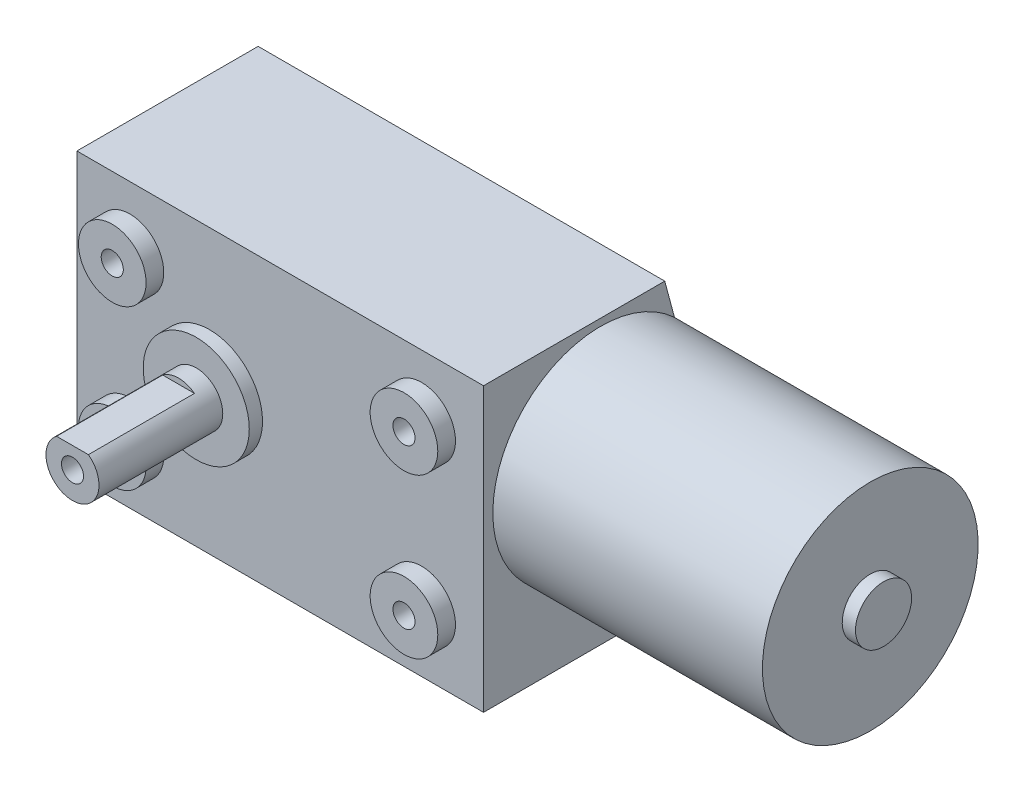
ISO-10303-21;
HEADER;
FILE_DESCRIPTION(('STEP AP214'),'2;1');
FILE_NAME('part.step','',(''),(''),'','','');
FILE_SCHEMA(('AUTOMOTIVE_DESIGN { 1 0 10303 214 1 1 1 1 }'));
ENDSEC;
DATA;
#1=APPLICATION_CONTEXT('core data for automotive mechanical design processes');
#2=APPLICATION_PROTOCOL_DEFINITION('international standard','automotive_design',2000,#1);
#3=PRODUCT_CONTEXT('',#1,'mechanical');
#4=PRODUCT('Part','Part','',(#3));
#5=PRODUCT_RELATED_PRODUCT_CATEGORY('part','',(#4));
#6=PRODUCT_DEFINITION_FORMATION('','',#4);
#7=PRODUCT_DEFINITION_CONTEXT('part definition',#1,'design');
#8=PRODUCT_DEFINITION('design','',#6,#7);
#9=PRODUCT_DEFINITION_SHAPE('','',#8);
#10=(LENGTH_UNIT() NAMED_UNIT(*) SI_UNIT(.MILLI.,.METRE.));
#11=(NAMED_UNIT(*) PLANE_ANGLE_UNIT() SI_UNIT($,.RADIAN.));
#12=(NAMED_UNIT(*) SI_UNIT($,.STERADIAN.) SOLID_ANGLE_UNIT());
#13=UNCERTAINTY_MEASURE_WITH_UNIT(LENGTH_MEASURE(1.E-05),#10,'distance_accuracy_value','');
#14=(GEOMETRIC_REPRESENTATION_CONTEXT(3) GLOBAL_UNCERTAINTY_ASSIGNED_CONTEXT((#13)) GLOBAL_UNIT_ASSIGNED_CONTEXT((#10,
#11,#12)) REPRESENTATION_CONTEXT('',''));
#15=CARTESIAN_POINT('',(0.,0.,0.));
#16=DIRECTION('',(0.,0.,1.));
#17=DIRECTION('',(1.,0.,0.));
#18=AXIS2_PLACEMENT_3D('',#15,#16,#17);
#19=CARTESIAN_POINT('',(61.5,3.00000000000001,-2.));
#20=DIRECTION('',(1.,0.,0.));
#21=DIRECTION('',(0.,1.,0.));
#22=AXIS2_PLACEMENT_3D('',#19,#20,#21);
#23=PLANE('',#22);
#24=CARTESIAN_POINT('',(61.5,3.00000000000001,-2.));
#25=DIRECTION('',(1.,0.,0.));
#26=DIRECTION('',(0.,1.,0.));
#27=AXIS2_PLACEMENT_3D('',#24,#25,#26);
#28=CIRCLE('',#27,12.2);
#29=CARTESIAN_POINT('',(61.5,15.2,-2.));
#30=VERTEX_POINT('',#29);
#31=EDGE_CURVE('E150',#30,#30,#28,.T.);
#32=ORIENTED_EDGE('',*,*,#31,.T.);
#33=EDGE_LOOP('',(#32));
#34=FACE_BOUND('',#33,.T.);
#35=CARTESIAN_POINT('',(61.5,3.00000000000001,-2.));
#36=DIRECTION('',(1.,0.,0.));
#37=DIRECTION('',(0.,1.,0.));
#38=AXIS2_PLACEMENT_3D('',#35,#36,#37);
#39=CIRCLE('',#38,3.175);
#40=CARTESIAN_POINT('',(61.5,6.17500000000001,-2.));
#41=VERTEX_POINT('',#40);
#42=EDGE_CURVE('E156',#41,#41,#39,.T.);
#43=ORIENTED_EDGE('',*,*,#42,.F.);
#44=EDGE_LOOP('',(#43));
#45=FACE_BOUND('',#44,.T.);
#46=ADVANCED_FACE('F41',(#34,#45),#23,.T.);
#47=CARTESIAN_POINT('',(31.,16.,11.25));
#48=DIRECTION('',(-1.,0.,0.));
#49=DIRECTION('',(0.,-1.,0.));
#50=AXIS2_PLACEMENT_3D('',#47,#48,#49);
#51=PLANE('',#50);
#52=CARTESIAN_POINT('',(31.,3.,-2.));
#53=DIRECTION('',(1.,0.,0.));
#54=DIRECTION('',(0.,1.,0.));
#55=AXIS2_PLACEMENT_3D('',#52,#53,#54);
#56=CIRCLE('',#55,12.2);
#57=CARTESIAN_POINT('',(31.,11.894821257883,-10.3499793287357));
#58=VERTEX_POINT('',#57);
#59=CARTESIAN_POINT('',(31.,-4.95471558259627,-11.25));
#60=VERTEX_POINT('',#59);
#61=EDGE_CURVE('E13',#58,#60,#56,.T.);
#62=ORIENTED_EDGE('',*,*,#61,.F.);
#63=DIRECTION('',(0.,-0.965925826289068,-0.258819045102522));
#64=VECTOR('',#63,1.);
#65=CARTESIAN_POINT('',(31.,16.,-9.25));
#66=LINE('',#65,#64);
#67=CARTESIAN_POINT('',(31.,16.,-9.24999999999999));
#68=VERTEX_POINT('',#67);
#69=EDGE_CURVE('E260',#58,#68,#66,.F.);
#70=ORIENTED_EDGE('',*,*,#69,.T.);
#71=DIRECTION('',(0.,0.,-1.));
#72=VECTOR('',#71,1.);
#73=CARTESIAN_POINT('',(31.,16.,11.25));
#74=LINE('',#73,#72);
#75=CARTESIAN_POINT('',(31.,16.,11.25));
#76=VERTEX_POINT('',#75);
#77=EDGE_CURVE('E239',#76,#68,#74,.T.);
#78=ORIENTED_EDGE('',*,*,#77,.F.);
#79=DIRECTION('',(0.,1.,0.));
#80=VECTOR('',#79,1.);
#81=CARTESIAN_POINT('',(31.,16.,11.25));
#82=LINE('',#81,#80);
#83=CARTESIAN_POINT('',(31.,-16.,11.25));
#84=VERTEX_POINT('',#83);
#85=EDGE_CURVE('E230',#84,#76,#82,.T.);
#86=ORIENTED_EDGE('',*,*,#85,.F.);
#87=DIRECTION('',(0.,0.,-1.));
#88=VECTOR('',#87,1.);
#89=CARTESIAN_POINT('',(31.,-16.,11.25));
#90=LINE('',#89,#88);
#91=CARTESIAN_POINT('',(31.,-16.,-9.25));
#92=VERTEX_POINT('',#91);
#93=EDGE_CURVE('E242',#84,#92,#90,.T.);
#94=ORIENTED_EDGE('',*,*,#93,.T.);
#95=DIRECTION('',(0.,-0.965925826289068,0.258819045102522));
#96=VECTOR('',#95,1.);
#97=CARTESIAN_POINT('',(31.,-16.,-9.25));
#98=LINE('',#97,#96);
#99=CARTESIAN_POINT('',(31.,-8.53589838486227,-11.25));
#100=VERTEX_POINT('',#99);
#101=EDGE_CURVE('E130',#92,#100,#98,.F.);
#102=ORIENTED_EDGE('',*,*,#101,.T.);
#103=DIRECTION('',(0.,1.,0.));
#104=VECTOR('',#103,1.);
#105=CARTESIAN_POINT('',(31.,16.,-11.25));
#106=LINE('',#105,#104);
#107=EDGE_CURVE('E126',#100,#60,#106,.T.);
#108=ORIENTED_EDGE('',*,*,#107,.T.);
#109=EDGE_LOOP('',(#62,#70,#78,#86,#94,#102,#108));
#110=FACE_BOUND('',#109,.T.);
#111=ADVANCED_FACE('F128',(#110),#51,.F.);
#112=CARTESIAN_POINT('',(0.,0.,12.75));
#113=DIRECTION('',(0.,0.,1.));
#114=DIRECTION('',(1.,0.,0.));
#115=AXIS2_PLACEMENT_3D('',#112,#113,#114);
#116=PLANE('',#115);
#117=CARTESIAN_POINT('',(0.,0.,12.75));
#118=DIRECTION('',(0.,0.,1.));
#119=DIRECTION('',(1.,0.,0.));
#120=AXIS2_PLACEMENT_3D('',#117,#118,#119);
#121=CIRCLE('',#120,6.);
#122=CARTESIAN_POINT('',(6.,0.,12.75));
#123=VERTEX_POINT('',#122);
#124=EDGE_CURVE('E220',#123,#123,#121,.T.);
#125=ORIENTED_EDGE('',*,*,#124,.T.);
#126=EDGE_LOOP('',(#125));
#127=FACE_BOUND('',#126,.T.);
#128=CARTESIAN_POINT('',(0.,0.,12.75));
#129=DIRECTION('',(0.,0.,1.));
#130=DIRECTION('',(1.,0.,0.));
#131=AXIS2_PLACEMENT_3D('',#128,#129,#130);
#132=CIRCLE('',#131,3.);
#133=CARTESIAN_POINT('',(3.,0.,12.75));
#134=VERTEX_POINT('',#133);
#135=EDGE_CURVE('E197',#134,#134,#132,.T.);
#136=ORIENTED_EDGE('',*,*,#135,.F.);
#137=EDGE_LOOP('',(#136));
#138=FACE_BOUND('',#137,.T.);
#139=ADVANCED_FACE('F297',(#127,#138),#116,.T.);
#140=CARTESIAN_POINT('',(0.,0.,11.25));
#141=DIRECTION('',(0.,0.,1.));
#142=DIRECTION('',(1.,0.,0.));
#143=AXIS2_PLACEMENT_3D('',#140,#141,#142);
#144=PLANE('',#143);
#145=CARTESIAN_POINT('',(24.,9.,11.25));
#146=DIRECTION('',(0.,0.,1.));
#147=DIRECTION('',(1.,0.,0.));
#148=AXIS2_PLACEMENT_3D('',#145,#146,#147);
#149=CIRCLE('',#148,3.825);
#150=CARTESIAN_POINT('',(27.825,9.,11.25));
#151=VERTEX_POINT('',#150);
#152=EDGE_CURVE('E208',#151,#151,#149,.T.);
#153=ORIENTED_EDGE('',*,*,#152,.F.);
#154=EDGE_LOOP('',(#153));
#155=FACE_BOUND('',#154,.T.);
#156=CARTESIAN_POINT('',(-9.,9.,11.25));
#157=DIRECTION('',(0.,0.,1.));
#158=DIRECTION('',(1.,0.,0.));
#159=AXIS2_PLACEMENT_3D('',#156,#157,#158);
#160=CIRCLE('',#159,3.825);
#161=CARTESIAN_POINT('',(-5.175,9.,11.25));
#162=VERTEX_POINT('',#161);
#163=EDGE_CURVE('E216',#162,#162,#160,.T.);
#164=ORIENTED_EDGE('',*,*,#163,.F.);
#165=EDGE_LOOP('',(#164));
#166=FACE_BOUND('',#165,.T.);
#167=DIRECTION('',(0.,-1.,0.));
#168=VECTOR('',#167,1.);
#169=CARTESIAN_POINT('',(-15.,16.,11.25));
#170=LINE('',#169,#168);
#171=CARTESIAN_POINT('',(-15.,16.,11.25));
#172=VERTEX_POINT('',#171);
#173=CARTESIAN_POINT('',(-15.,-16.,11.25));
#174=VERTEX_POINT('',#173);
#175=EDGE_CURVE('E133',#172,#174,#170,.T.);
#176=ORIENTED_EDGE('',*,*,#175,.T.);
#177=DIRECTION('',(1.,0.,0.));
#178=VECTOR('',#177,1.);
#179=CARTESIAN_POINT('',(-15.,-16.,11.25));
#180=LINE('',#179,#178);
#181=EDGE_CURVE('E228',#174,#84,#180,.T.);
#182=ORIENTED_EDGE('',*,*,#181,.T.);
#183=ORIENTED_EDGE('',*,*,#85,.T.);
#184=DIRECTION('',(-1.,0.,0.));
#185=VECTOR('',#184,1.);
#186=CARTESIAN_POINT('',(-15.,16.,11.25));
#187=LINE('',#186,#185);
#188=EDGE_CURVE('E232',#76,#172,#187,.T.);
#189=ORIENTED_EDGE('',*,*,#188,.T.);
#190=EDGE_LOOP('',(#176,#182,#183,#189));
#191=FACE_BOUND('',#190,.T.);
#192=CARTESIAN_POINT('',(0.,0.,11.25));
#193=DIRECTION('',(0.,0.,1.));
#194=DIRECTION('',(1.,0.,0.));
#195=AXIS2_PLACEMENT_3D('',#192,#193,#194);
#196=CIRCLE('',#195,6.);
#197=CARTESIAN_POINT('',(6.,0.,11.25));
#198=VERTEX_POINT('',#197);
#199=EDGE_CURVE('E223',#198,#198,#196,.T.);
#200=ORIENTED_EDGE('',*,*,#199,.F.);
#201=EDGE_LOOP('',(#200));
#202=FACE_BOUND('',#201,.T.);
#203=CARTESIAN_POINT('',(-9.,-9.,11.25));
#204=DIRECTION('',(0.,0.,1.));
#205=DIRECTION('',(1.,0.,0.));
#206=AXIS2_PLACEMENT_3D('',#203,#204,#205);
#207=CIRCLE('',#206,3.825);
#208=CARTESIAN_POINT('',(-5.175,-9.,11.25));
#209=VERTEX_POINT('',#208);
#210=EDGE_CURVE('E212',#209,#209,#207,.T.);
#211=ORIENTED_EDGE('',*,*,#210,.F.);
#212=EDGE_LOOP('',(#211));
#213=FACE_BOUND('',#212,.T.);
#214=CARTESIAN_POINT('',(24.,-9.,11.25));
#215=DIRECTION('',(0.,0.,1.));
#216=DIRECTION('',(1.,0.,0.));
#217=AXIS2_PLACEMENT_3D('',#214,#215,#216);
#218=CIRCLE('',#217,3.825);
#219=CARTESIAN_POINT('',(27.825,-9.,11.25));
#220=VERTEX_POINT('',#219);
#221=EDGE_CURVE('E202',#220,#220,#218,.T.);
#222=ORIENTED_EDGE('',*,*,#221,.F.);
#223=EDGE_LOOP('',(#222));
#224=FACE_BOUND('',#223,.T.);
#225=ADVANCED_FACE('F278',(#155,#166,#191,#202,#213,#224),#144,.T.);
#226=CARTESIAN_POINT('',(-15.,16.,11.25));
#227=DIRECTION('',(1.,0.,0.));
#228=DIRECTION('',(0.,1.,0.));
#229=AXIS2_PLACEMENT_3D('',#226,#227,#228);
#230=PLANE('',#229);
#231=DIRECTION('',(0.,-1.,0.));
#232=VECTOR('',#231,1.);
#233=CARTESIAN_POINT('',(-15.,16.,-11.25));
#234=LINE('',#233,#232);
#235=CARTESIAN_POINT('',(-15.,8.53589838486227,-11.25));
#236=VERTEX_POINT('',#235);
#237=CARTESIAN_POINT('',(-15.,-8.53589838486205,-11.25));
#238=VERTEX_POINT('',#237);
#239=EDGE_CURVE('E144',#236,#238,#234,.T.);
#240=ORIENTED_EDGE('',*,*,#239,.T.);
#241=DIRECTION('',(0.,0.965925826289068,-0.258819045102522));
#242=VECTOR('',#241,1.);
#243=CARTESIAN_POINT('',(-15.,-16.,-9.25));
#244=LINE('',#243,#242);
#245=CARTESIAN_POINT('',(-15.,-16.,-9.25));
#246=VERTEX_POINT('',#245);
#247=EDGE_CURVE('E266',#238,#246,#244,.F.);
#248=ORIENTED_EDGE('',*,*,#247,.T.);
#249=DIRECTION('',(0.,0.,-1.));
#250=VECTOR('',#249,1.);
#251=CARTESIAN_POINT('',(-15.,-16.,11.25));
#252=LINE('',#251,#250);
#253=EDGE_CURVE('E244',#174,#246,#252,.T.);
#254=ORIENTED_EDGE('',*,*,#253,.F.);
#255=ORIENTED_EDGE('',*,*,#175,.F.);
#256=DIRECTION('',(0.,0.,-1.));
#257=VECTOR('',#256,1.);
#258=CARTESIAN_POINT('',(-15.,16.,11.25));
#259=LINE('',#258,#257);
#260=CARTESIAN_POINT('',(-15.,16.,-9.24999999999999));
#261=VERTEX_POINT('',#260);
#262=EDGE_CURVE('E234',#172,#261,#259,.T.);
#263=ORIENTED_EDGE('',*,*,#262,.T.);
#264=DIRECTION('',(0.,0.965925826289068,0.258819045102522));
#265=VECTOR('',#264,1.);
#266=CARTESIAN_POINT('',(-15.,16.,-9.25));
#267=LINE('',#266,#265);
#268=EDGE_CURVE('E64',#261,#236,#267,.F.);
#269=ORIENTED_EDGE('',*,*,#268,.T.);
#270=EDGE_LOOP('',(#240,#248,#254,#255,#263,#269));
#271=FACE_BOUND('',#270,.T.);
#272=ADVANCED_FACE('F276',(#271),#230,.F.);
#273=CARTESIAN_POINT('',(-15.,-16.,11.25));
#274=DIRECTION('',(0.,1.,0.));
#275=DIRECTION('',(-1.,0.,0.));
#276=AXIS2_PLACEMENT_3D('',#273,#274,#275);
#277=PLANE('',#276);
#278=ORIENTED_EDGE('',*,*,#253,.T.);
#279=DIRECTION('',(1.,0.,0.));
#280=VECTOR('',#279,1.);
#281=CARTESIAN_POINT('',(-15.,-16.,-9.25));
#282=LINE('',#281,#280);
#283=EDGE_CURVE('E257',#246,#92,#282,.T.);
#284=ORIENTED_EDGE('',*,*,#283,.T.);
#285=ORIENTED_EDGE('',*,*,#93,.F.);
#286=ORIENTED_EDGE('',*,*,#181,.F.);
#287=EDGE_LOOP('',(#278,#284,#285,#286));
#288=FACE_BOUND('',#287,.T.);
#289=ADVANCED_FACE('F396',(#288),#277,.F.);
#290=CARTESIAN_POINT('',(-15.,16.,11.25));
#291=DIRECTION('',(0.,-1.,0.));
#292=DIRECTION('',(0.,0.,-1.));
#293=AXIS2_PLACEMENT_3D('',#290,#291,#292);
#294=PLANE('',#293);
#295=ORIENTED_EDGE('',*,*,#77,.T.);
#296=DIRECTION('',(-1.,0.,0.));
#297=VECTOR('',#296,1.);
#298=CARTESIAN_POINT('',(-15.,16.,-9.25));
#299=LINE('',#298,#297);
#300=EDGE_CURVE('E45',#68,#261,#299,.T.);
#301=ORIENTED_EDGE('',*,*,#300,.T.);
#302=ORIENTED_EDGE('',*,*,#262,.F.);
#303=ORIENTED_EDGE('',*,*,#188,.F.);
#304=EDGE_LOOP('',(#295,#301,#302,#303));
#305=FACE_BOUND('',#304,.T.);
#306=ADVANCED_FACE('F272',(#305),#294,.F.);
#307=CARTESIAN_POINT('',(0.,0.,-11.25));
#308=DIRECTION('',(0.,0.,1.));
#309=DIRECTION('',(1.,0.,0.));
#310=AXIS2_PLACEMENT_3D('',#307,#308,#309);
#311=PLANE('',#310);
#312=ORIENTED_EDGE('',*,*,#107,.F.);
#313=DIRECTION('',(-1.,0.,0.));
#314=VECTOR('',#313,1.);
#315=CARTESIAN_POINT('',(0.,-8.53589838486228,-11.25));
#316=LINE('',#315,#314);
#317=EDGE_CURVE('E264',#100,#238,#316,.T.);
#318=ORIENTED_EDGE('',*,*,#317,.T.);
#319=ORIENTED_EDGE('',*,*,#239,.F.);
#320=DIRECTION('',(1.,0.,0.));
#321=VECTOR('',#320,1.);
#322=CARTESIAN_POINT('',(0.,8.53589838486227,-11.25));
#323=LINE('',#322,#321);
#324=CARTESIAN_POINT('',(31.,8.53589838486226,-11.25));
#325=VERTEX_POINT('',#324);
#326=EDGE_CURVE('E139',#236,#325,#323,.T.);
#327=ORIENTED_EDGE('',*,*,#326,.T.);
#328=EDGE_CURVE('E134',#60,#325,#106,.T.);
#329=ORIENTED_EDGE('',*,*,#328,.F.);
#330=EDGE_LOOP('',(#312,#318,#319,#327,#329));
#331=FACE_BOUND('',#330,.T.);
#332=ADVANCED_FACE('F137',(#331),#311,.F.);
#333=CARTESIAN_POINT('',(0.,0.,12.75));
#334=DIRECTION('',(0.,0.,-1.));
#335=DIRECTION('',(-1.,0.,0.));
#336=AXIS2_PLACEMENT_3D('',#333,#334,#335);
#337=CYLINDRICAL_SURFACE('',#336,6.);
#338=ORIENTED_EDGE('',*,*,#124,.F.);
#339=EDGE_LOOP('',(#338));
#340=FACE_BOUND('',#339,.T.);
#341=ORIENTED_EDGE('',*,*,#199,.T.);
#342=EDGE_LOOP('',(#341));
#343=FACE_BOUND('',#342,.T.);
#344=ADVANCED_FACE('F382',(#340,#343),#337,.T.);
#345=CARTESIAN_POINT('',(-9.,9.,12.75));
#346=DIRECTION('',(0.,0.,-1.));
#347=DIRECTION('',(-1.,0.,0.));
#348=AXIS2_PLACEMENT_3D('',#345,#346,#347);
#349=CYLINDRICAL_SURFACE('',#348,3.825);
#350=CARTESIAN_POINT('',(-9.,9.,13.25));
#351=DIRECTION('',(0.,0.,1.));
#352=DIRECTION('',(1.,0.,0.));
#353=AXIS2_PLACEMENT_3D('',#350,#351,#352);
#354=CIRCLE('',#353,3.825);
#355=CARTESIAN_POINT('',(-5.175,9.,13.25));
#356=VERTEX_POINT('',#355);
#357=EDGE_CURVE('E219',#356,#356,#354,.T.);
#358=ORIENTED_EDGE('',*,*,#357,.F.);
#359=EDGE_LOOP('',(#358));
#360=FACE_BOUND('',#359,.T.);
#361=ORIENTED_EDGE('',*,*,#163,.T.);
#362=EDGE_LOOP('',(#361));
#363=FACE_BOUND('',#362,.T.);
#364=ADVANCED_FACE('F379',(#360,#363),#349,.T.);
#365=CARTESIAN_POINT('',(-9.,9.,13.25));
#366=DIRECTION('',(0.,0.,1.));
#367=DIRECTION('',(1.,0.,0.));
#368=AXIS2_PLACEMENT_3D('',#365,#366,#367);
#369=PLANE('',#368);
#370=CARTESIAN_POINT('',(-9.,9.,13.25));
#371=DIRECTION('',(0.,0.,1.));
#372=DIRECTION('',(1.,0.,0.));
#373=AXIS2_PLACEMENT_3D('',#370,#371,#372);
#374=CIRCLE('',#373,1.24999999999999);
#375=CARTESIAN_POINT('',(-7.75000000000001,9.,13.25));
#376=VERTEX_POINT('',#375);
#377=EDGE_CURVE('E164',#376,#376,#374,.T.);
#378=ORIENTED_EDGE('',*,*,#377,.F.);
#379=EDGE_LOOP('',(#378));
#380=FACE_BOUND('',#379,.T.);
#381=ORIENTED_EDGE('',*,*,#357,.T.);
#382=EDGE_LOOP('',(#381));
#383=FACE_BOUND('',#382,.T.);
#384=ADVANCED_FACE('F377',(#380,#383),#369,.T.);
#385=CARTESIAN_POINT('',(-9.,-9.,12.75));
#386=DIRECTION('',(0.,0.,-1.));
#387=DIRECTION('',(-1.,0.,0.));
#388=AXIS2_PLACEMENT_3D('',#385,#386,#387);
#389=CYLINDRICAL_SURFACE('',#388,3.825);
#390=CARTESIAN_POINT('',(-9.,-9.,13.25));
#391=DIRECTION('',(0.,0.,1.));
#392=DIRECTION('',(1.,0.,0.));
#393=AXIS2_PLACEMENT_3D('',#390,#391,#392);
#394=CIRCLE('',#393,3.825);
#395=CARTESIAN_POINT('',(-5.175,-9.,13.25));
#396=VERTEX_POINT('',#395);
#397=EDGE_CURVE('E215',#396,#396,#394,.T.);
#398=ORIENTED_EDGE('',*,*,#397,.F.);
#399=EDGE_LOOP('',(#398));
#400=FACE_BOUND('',#399,.T.);
#401=ORIENTED_EDGE('',*,*,#210,.T.);
#402=EDGE_LOOP('',(#401));
#403=FACE_BOUND('',#402,.T.);
#404=ADVANCED_FACE('F374',(#400,#403),#389,.T.);
#405=CARTESIAN_POINT('',(-9.,-9.,13.25));
#406=DIRECTION('',(0.,0.,1.));
#407=DIRECTION('',(1.,0.,0.));
#408=AXIS2_PLACEMENT_3D('',#405,#406,#407);
#409=PLANE('',#408);
#410=CARTESIAN_POINT('',(-9.,-9.,13.25));
#411=DIRECTION('',(0.,0.,1.));
#412=DIRECTION('',(1.,0.,0.));
#413=AXIS2_PLACEMENT_3D('',#410,#411,#412);
#414=CIRCLE('',#413,1.24999999999999);
#415=CARTESIAN_POINT('',(-7.75000000000001,-9.,13.25));
#416=VERTEX_POINT('',#415);
#417=EDGE_CURVE('E170',#416,#416,#414,.T.);
#418=ORIENTED_EDGE('',*,*,#417,.F.);
#419=EDGE_LOOP('',(#418));
#420=FACE_BOUND('',#419,.T.);
#421=ORIENTED_EDGE('',*,*,#397,.T.);
#422=EDGE_LOOP('',(#421));
#423=FACE_BOUND('',#422,.T.);
#424=ADVANCED_FACE('F372',(#420,#423),#409,.T.);
#425=CARTESIAN_POINT('',(24.,9.,12.75));
#426=DIRECTION('',(0.,0.,-1.));
#427=DIRECTION('',(-1.,0.,0.));
#428=AXIS2_PLACEMENT_3D('',#425,#426,#427);
#429=CYLINDRICAL_SURFACE('',#428,3.825);
#430=CARTESIAN_POINT('',(24.,9.,13.25));
#431=DIRECTION('',(0.,0.,1.));
#432=DIRECTION('',(1.,0.,0.));
#433=AXIS2_PLACEMENT_3D('',#430,#431,#432);
#434=CIRCLE('',#433,3.825);
#435=CARTESIAN_POINT('',(27.825,9.,13.25));
#436=VERTEX_POINT('',#435);
#437=EDGE_CURVE('E211',#436,#436,#434,.T.);
#438=ORIENTED_EDGE('',*,*,#437,.F.);
#439=EDGE_LOOP('',(#438));
#440=FACE_BOUND('',#439,.T.);
#441=ORIENTED_EDGE('',*,*,#152,.T.);
#442=EDGE_LOOP('',(#441));
#443=FACE_BOUND('',#442,.T.);
#444=ADVANCED_FACE('F369',(#440,#443),#429,.T.);
#445=CARTESIAN_POINT('',(24.,9.,13.25));
#446=DIRECTION('',(0.,0.,1.));
#447=DIRECTION('',(1.,0.,0.));
#448=AXIS2_PLACEMENT_3D('',#445,#446,#447);
#449=PLANE('',#448);
#450=CARTESIAN_POINT('',(24.,9.,13.25));
#451=DIRECTION('',(0.,0.,1.));
#452=DIRECTION('',(1.,0.,0.));
#453=AXIS2_PLACEMENT_3D('',#450,#451,#452);
#454=CIRCLE('',#453,1.24999999999999);
#455=CARTESIAN_POINT('',(25.25,9.,13.25));
#456=VERTEX_POINT('',#455);
#457=EDGE_CURVE('E176',#456,#456,#454,.T.);
#458=ORIENTED_EDGE('',*,*,#457,.F.);
#459=EDGE_LOOP('',(#458));
#460=FACE_BOUND('',#459,.T.);
#461=ORIENTED_EDGE('',*,*,#437,.T.);
#462=EDGE_LOOP('',(#461));
#463=FACE_BOUND('',#462,.T.);
#464=ADVANCED_FACE('F367',(#460,#463),#449,.T.);
#465=CARTESIAN_POINT('',(24.,-9.,12.75));
#466=DIRECTION('',(0.,0.,-1.));
#467=DIRECTION('',(-1.,0.,0.));
#468=AXIS2_PLACEMENT_3D('',#465,#466,#467);
#469=CYLINDRICAL_SURFACE('',#468,3.825);
#470=CARTESIAN_POINT('',(24.,-9.,13.25));
#471=DIRECTION('',(0.,0.,1.));
#472=DIRECTION('',(1.,0.,0.));
#473=AXIS2_PLACEMENT_3D('',#470,#471,#472);
#474=CIRCLE('',#473,3.825);
#475=CARTESIAN_POINT('',(27.825,-9.,13.25));
#476=VERTEX_POINT('',#475);
#477=EDGE_CURVE('E207',#476,#476,#474,.T.);
#478=ORIENTED_EDGE('',*,*,#477,.F.);
#479=EDGE_LOOP('',(#478));
#480=FACE_BOUND('',#479,.T.);
#481=ORIENTED_EDGE('',*,*,#221,.T.);
#482=EDGE_LOOP('',(#481));
#483=FACE_BOUND('',#482,.T.);
#484=ADVANCED_FACE('F364',(#480,#483),#469,.T.);
#485=CARTESIAN_POINT('',(24.,-9.,13.25));
#486=DIRECTION('',(0.,0.,1.));
#487=DIRECTION('',(1.,0.,0.));
#488=AXIS2_PLACEMENT_3D('',#485,#486,#487);
#489=PLANE('',#488);
#490=CARTESIAN_POINT('',(24.,-9.,13.25));
#491=DIRECTION('',(0.,0.,1.));
#492=DIRECTION('',(1.,0.,0.));
#493=AXIS2_PLACEMENT_3D('',#490,#491,#492);
#494=CIRCLE('',#493,1.24999999999999);
#495=CARTESIAN_POINT('',(25.25,-9.,13.25));
#496=VERTEX_POINT('',#495);
#497=EDGE_CURVE('E182',#496,#496,#494,.T.);
#498=ORIENTED_EDGE('',*,*,#497,.F.);
#499=EDGE_LOOP('',(#498));
#500=FACE_BOUND('',#499,.T.);
#501=ORIENTED_EDGE('',*,*,#477,.T.);
#502=EDGE_LOOP('',(#501));
#503=FACE_BOUND('',#502,.T.);
#504=ADVANCED_FACE('F362',(#500,#503),#489,.T.);
#505=CARTESIAN_POINT('',(0.,0.,26.75));
#506=DIRECTION('',(0.,0.,-1.));
#507=DIRECTION('',(-1.,0.,0.));
#508=AXIS2_PLACEMENT_3D('',#505,#506,#507);
#509=CYLINDRICAL_SURFACE('',#508,3.);
#510=CARTESIAN_POINT('',(0.,0.,26.75));
#511=DIRECTION('',(0.,0.,1.));
#512=DIRECTION('',(1.,0.,0.));
#513=AXIS2_PLACEMENT_3D('',#510,#511,#512);
#514=CIRCLE('',#513,3.);
#515=CARTESIAN_POINT('',(-1.8,2.4,26.75));
#516=VERTEX_POINT('',#515);
#517=CARTESIAN_POINT('',(1.8,2.4,26.75));
#518=VERTEX_POINT('',#517);
#519=EDGE_CURVE('E199',#516,#518,#514,.T.);
#520=ORIENTED_EDGE('',*,*,#519,.F.);
#521=DIRECTION('',(0.,0.,1.));
#522=VECTOR('',#521,1.);
#523=CARTESIAN_POINT('',(-1.8,2.4,14.75));
#524=LINE('',#523,#522);
#525=CARTESIAN_POINT('',(-1.8,2.4,14.75));
#526=VERTEX_POINT('',#525);
#527=EDGE_CURVE('E192',#526,#516,#524,.T.);
#528=ORIENTED_EDGE('',*,*,#527,.F.);
#529=CARTESIAN_POINT('',(0.,0.,14.75));
#530=DIRECTION('',(0.,0.,1.));
#531=DIRECTION('',(1.,0.,0.));
#532=AXIS2_PLACEMENT_3D('',#529,#530,#531);
#533=CIRCLE('',#532,3.);
#534=CARTESIAN_POINT('',(1.8,2.4,14.75));
#535=VERTEX_POINT('',#534);
#536=EDGE_CURVE('E247',#535,#526,#533,.T.);
#537=ORIENTED_EDGE('',*,*,#536,.F.);
#538=DIRECTION('',(0.,0.,1.));
#539=VECTOR('',#538,1.);
#540=CARTESIAN_POINT('',(1.8,2.4,14.75));
#541=LINE('',#540,#539);
#542=EDGE_CURVE('E194',#535,#518,#541,.T.);
#543=ORIENTED_EDGE('',*,*,#542,.T.);
#544=EDGE_LOOP('',(#520,#528,#537,#543));
#545=FACE_BOUND('',#544,.T.);
#546=ORIENTED_EDGE('',*,*,#135,.T.);
#547=EDGE_LOOP('',(#546));
#548=FACE_BOUND('',#547,.T.);
#549=ADVANCED_FACE('F358',(#545,#548),#509,.T.);
#550=CARTESIAN_POINT('',(0.,0.,26.75));
#551=DIRECTION('',(0.,0.,1.));
#552=DIRECTION('',(1.,0.,0.));
#553=AXIS2_PLACEMENT_3D('',#550,#551,#552);
#554=PLANE('',#553);
#555=CARTESIAN_POINT('',(0.,0.,26.75));
#556=DIRECTION('',(0.,0.,1.));
#557=DIRECTION('',(1.,0.,0.));
#558=AXIS2_PLACEMENT_3D('',#555,#556,#557);
#559=CIRCLE('',#558,1.24999999999999);
#560=CARTESIAN_POINT('',(1.24999999999999,0.,26.75));
#561=VERTEX_POINT('',#560);
#562=EDGE_CURVE('E153',#561,#561,#559,.T.);
#563=ORIENTED_EDGE('',*,*,#562,.F.);
#564=EDGE_LOOP('',(#563));
#565=FACE_BOUND('',#564,.T.);
#566=DIRECTION('',(1.,0.,0.));
#567=VECTOR('',#566,1.);
#568=CARTESIAN_POINT('',(-1.8,2.4,26.75));
#569=LINE('',#568,#567);
#570=EDGE_CURVE('E188',#516,#518,#569,.T.);
#571=ORIENTED_EDGE('',*,*,#570,.F.);
#572=ORIENTED_EDGE('',*,*,#519,.T.);
#573=EDGE_LOOP('',(#571,#572));
#574=FACE_BOUND('',#573,.T.);
#575=ADVANCED_FACE('F351',(#565,#574),#554,.T.);
#576=CARTESIAN_POINT('',(0.,0.,14.75));
#577=DIRECTION('',(0.,0.,1.));
#578=DIRECTION('',(1.,0.,0.));
#579=AXIS2_PLACEMENT_3D('',#576,#577,#578);
#580=PLANE('',#579);
#581=DIRECTION('',(1.,0.,0.));
#582=VECTOR('',#581,1.);
#583=CARTESIAN_POINT('',(-1.8,2.4,14.75));
#584=LINE('',#583,#582);
#585=EDGE_CURVE('E189',#526,#535,#584,.T.);
#586=ORIENTED_EDGE('',*,*,#585,.T.);
#587=ORIENTED_EDGE('',*,*,#536,.T.);
#588=EDGE_LOOP('',(#586,#587));
#589=FACE_BOUND('',#588,.T.);
#590=ADVANCED_FACE('F348',(#589),#580,.T.);
#591=CARTESIAN_POINT('',(-1.8,2.4,14.75));
#592=DIRECTION('',(0.,-1.,0.));
#593=DIRECTION('',(0.,0.,-1.));
#594=AXIS2_PLACEMENT_3D('',#591,#592,#593);
#595=PLANE('',#594);
#596=ORIENTED_EDGE('',*,*,#570,.T.);
#597=ORIENTED_EDGE('',*,*,#542,.F.);
#598=ORIENTED_EDGE('',*,*,#585,.F.);
#599=ORIENTED_EDGE('',*,*,#527,.T.);
#600=EDGE_LOOP('',(#596,#597,#598,#599));
#601=FACE_BOUND('',#600,.T.);
#602=ADVANCED_FACE('F346',(#601),#595,.F.);
#603=CARTESIAN_POINT('',(24.,-9.,4.75));
#604=DIRECTION('',(0.,0.,1.));
#605=DIRECTION('',(1.,0.,0.));
#606=AXIS2_PLACEMENT_3D('',#603,#604,#605);
#607=CONICAL_SURFACE('',#606,1.25,1.02974425867665);
#608=CARTESIAN_POINT('',(24.,-9.,3.99892422621555));
#609=VERTEX_POINT('',#608);
#610=VERTEX_LOOP('',#609);
#611=FACE_BOUND('',#610,.T.);
#612=CARTESIAN_POINT('',(24.,-9.,4.75));
#613=DIRECTION('',(0.,0.,1.));
#614=DIRECTION('',(1.,0.,0.));
#615=AXIS2_PLACEMENT_3D('',#612,#613,#614);
#616=CIRCLE('',#615,1.25);
#617=CARTESIAN_POINT('',(25.25,-9.,4.75));
#618=VERTEX_POINT('',#617);
#619=EDGE_CURVE('E185',#618,#618,#616,.T.);
#620=ORIENTED_EDGE('',*,*,#619,.T.);
#621=EDGE_LOOP('',(#620));
#622=FACE_BOUND('',#621,.T.);
#623=ADVANCED_FACE('F342',(#611,#622),#607,.F.);
#624=CARTESIAN_POINT('',(24.,-9.,13.25));
#625=DIRECTION('',(0.,0.,1.));
#626=DIRECTION('',(1.,0.,0.));
#627=AXIS2_PLACEMENT_3D('',#624,#625,#626);
#628=CYLINDRICAL_SURFACE('',#627,1.24999999999999);
#629=ORIENTED_EDGE('',*,*,#619,.F.);
#630=EDGE_LOOP('',(#629));
#631=FACE_BOUND('',#630,.T.);
#632=ORIENTED_EDGE('',*,*,#497,.T.);
#633=EDGE_LOOP('',(#632));
#634=FACE_BOUND('',#633,.T.);
#635=ADVANCED_FACE('F338',(#631,#634),#628,.F.);
#636=CARTESIAN_POINT('',(24.,9.,4.75));
#637=DIRECTION('',(0.,0.,1.));
#638=DIRECTION('',(1.,0.,0.));
#639=AXIS2_PLACEMENT_3D('',#636,#637,#638);
#640=CONICAL_SURFACE('',#639,1.25,1.02974425867665);
#641=CARTESIAN_POINT('',(24.,9.,3.99892422621555));
#642=VERTEX_POINT('',#641);
#643=VERTEX_LOOP('',#642);
#644=FACE_BOUND('',#643,.T.);
#645=CARTESIAN_POINT('',(24.,9.,4.75));
#646=DIRECTION('',(0.,0.,1.));
#647=DIRECTION('',(1.,0.,0.));
#648=AXIS2_PLACEMENT_3D('',#645,#646,#647);
#649=CIRCLE('',#648,1.25);
#650=CARTESIAN_POINT('',(25.25,9.,4.75));
#651=VERTEX_POINT('',#650);
#652=EDGE_CURVE('E179',#651,#651,#649,.T.);
#653=ORIENTED_EDGE('',*,*,#652,.T.);
#654=EDGE_LOOP('',(#653));
#655=FACE_BOUND('',#654,.T.);
#656=ADVANCED_FACE('F334',(#644,#655),#640,.F.);
#657=CARTESIAN_POINT('',(24.,9.,13.25));
#658=DIRECTION('',(0.,0.,1.));
#659=DIRECTION('',(1.,0.,0.));
#660=AXIS2_PLACEMENT_3D('',#657,#658,#659);
#661=CYLINDRICAL_SURFACE('',#660,1.24999999999999);
#662=ORIENTED_EDGE('',*,*,#652,.F.);
#663=EDGE_LOOP('',(#662));
#664=FACE_BOUND('',#663,.T.);
#665=ORIENTED_EDGE('',*,*,#457,.T.);
#666=EDGE_LOOP('',(#665));
#667=FACE_BOUND('',#666,.T.);
#668=ADVANCED_FACE('F330',(#664,#667),#661,.F.);
#669=CARTESIAN_POINT('',(-9.,-9.,4.75));
#670=DIRECTION('',(0.,0.,1.));
#671=DIRECTION('',(1.,0.,0.));
#672=AXIS2_PLACEMENT_3D('',#669,#670,#671);
#673=CONICAL_SURFACE('',#672,1.25,1.02974425867665);
#674=CARTESIAN_POINT('',(-9.,-9.,3.99892422621555));
#675=VERTEX_POINT('',#674);
#676=VERTEX_LOOP('',#675);
#677=FACE_BOUND('',#676,.T.);
#678=CARTESIAN_POINT('',(-9.,-9.,4.75));
#679=DIRECTION('',(0.,0.,1.));
#680=DIRECTION('',(1.,0.,0.));
#681=AXIS2_PLACEMENT_3D('',#678,#679,#680);
#682=CIRCLE('',#681,1.25);
#683=CARTESIAN_POINT('',(-7.75,-9.,4.75));
#684=VERTEX_POINT('',#683);
#685=EDGE_CURVE('E173',#684,#684,#682,.T.);
#686=ORIENTED_EDGE('',*,*,#685,.T.);
#687=EDGE_LOOP('',(#686));
#688=FACE_BOUND('',#687,.T.);
#689=ADVANCED_FACE('F326',(#677,#688),#673,.F.);
#690=CARTESIAN_POINT('',(-9.,-9.,13.25));
#691=DIRECTION('',(0.,0.,1.));
#692=DIRECTION('',(1.,0.,0.));
#693=AXIS2_PLACEMENT_3D('',#690,#691,#692);
#694=CYLINDRICAL_SURFACE('',#693,1.24999999999999);
#695=ORIENTED_EDGE('',*,*,#685,.F.);
#696=EDGE_LOOP('',(#695));
#697=FACE_BOUND('',#696,.T.);
#698=ORIENTED_EDGE('',*,*,#417,.T.);
#699=EDGE_LOOP('',(#698));
#700=FACE_BOUND('',#699,.T.);
#701=ADVANCED_FACE('F322',(#697,#700),#694,.F.);
#702=CARTESIAN_POINT('',(-9.,9.,4.75));
#703=DIRECTION('',(0.,0.,1.));
#704=DIRECTION('',(1.,0.,0.));
#705=AXIS2_PLACEMENT_3D('',#702,#703,#704);
#706=CONICAL_SURFACE('',#705,1.25,1.02974425867665);
#707=CARTESIAN_POINT('',(-9.,9.,3.99892422621555));
#708=VERTEX_POINT('',#707);
#709=VERTEX_LOOP('',#708);
#710=FACE_BOUND('',#709,.T.);
#711=CARTESIAN_POINT('',(-9.,9.,4.75));
#712=DIRECTION('',(0.,0.,1.));
#713=DIRECTION('',(1.,0.,0.));
#714=AXIS2_PLACEMENT_3D('',#711,#712,#713);
#715=CIRCLE('',#714,1.25);
#716=CARTESIAN_POINT('',(-7.75,9.,4.75));
#717=VERTEX_POINT('',#716);
#718=EDGE_CURVE('E167',#717,#717,#715,.T.);
#719=ORIENTED_EDGE('',*,*,#718,.T.);
#720=EDGE_LOOP('',(#719));
#721=FACE_BOUND('',#720,.T.);
#722=ADVANCED_FACE('F318',(#710,#721),#706,.F.);
#723=CARTESIAN_POINT('',(-9.,9.,13.25));
#724=DIRECTION('',(0.,0.,1.));
#725=DIRECTION('',(1.,0.,0.));
#726=AXIS2_PLACEMENT_3D('',#723,#724,#725);
#727=CYLINDRICAL_SURFACE('',#726,1.24999999999999);
#728=ORIENTED_EDGE('',*,*,#718,.F.);
#729=EDGE_LOOP('',(#728));
#730=FACE_BOUND('',#729,.T.);
#731=ORIENTED_EDGE('',*,*,#377,.T.);
#732=EDGE_LOOP('',(#731));
#733=FACE_BOUND('',#732,.T.);
#734=ADVANCED_FACE('F314',(#730,#733),#727,.F.);
#735=CARTESIAN_POINT('',(0.,0.,18.25));
#736=DIRECTION('',(0.,0.,1.));
#737=DIRECTION('',(1.,0.,0.));
#738=AXIS2_PLACEMENT_3D('',#735,#736,#737);
#739=CONICAL_SURFACE('',#738,1.24999999999999,1.02974425867665);
#740=CARTESIAN_POINT('',(0.,0.,17.4989242262156));
#741=VERTEX_POINT('',#740);
#742=VERTEX_LOOP('',#741);
#743=FACE_BOUND('',#742,.T.);
#744=CARTESIAN_POINT('',(0.,0.,18.25));
#745=DIRECTION('',(0.,0.,1.));
#746=DIRECTION('',(1.,0.,0.));
#747=AXIS2_PLACEMENT_3D('',#744,#745,#746);
#748=CIRCLE('',#747,1.24999999999999);
#749=CARTESIAN_POINT('',(1.24999999999999,0.,18.25));
#750=VERTEX_POINT('',#749);
#751=EDGE_CURVE('E161',#750,#750,#748,.T.);
#752=ORIENTED_EDGE('',*,*,#751,.T.);
#753=EDGE_LOOP('',(#752));
#754=FACE_BOUND('',#753,.T.);
#755=ADVANCED_FACE('F310',(#743,#754),#739,.F.);
#756=CARTESIAN_POINT('',(0.,0.,26.75));
#757=DIRECTION('',(0.,0.,1.));
#758=DIRECTION('',(1.,0.,0.));
#759=AXIS2_PLACEMENT_3D('',#756,#757,#758);
#760=CYLINDRICAL_SURFACE('',#759,1.24999999999999);
#761=ORIENTED_EDGE('',*,*,#751,.F.);
#762=EDGE_LOOP('',(#761));
#763=FACE_BOUND('',#762,.T.);
#764=ORIENTED_EDGE('',*,*,#562,.T.);
#765=EDGE_LOOP('',(#764));
#766=FACE_BOUND('',#765,.T.);
#767=ADVANCED_FACE('F289',(#763,#766),#760,.F.);
#768=CARTESIAN_POINT('',(-15.,-16.,-9.25));
#769=DIRECTION('',(0.,0.258819045102522,0.965925826289068));
#770=DIRECTION('',(1.,0.,0.));
#771=AXIS2_PLACEMENT_3D('',#768,#769,#770);
#772=PLANE('',#771);
#773=ORIENTED_EDGE('',*,*,#247,.F.);
#774=ORIENTED_EDGE('',*,*,#317,.F.);
#775=ORIENTED_EDGE('',*,*,#101,.F.);
#776=ORIENTED_EDGE('',*,*,#283,.F.);
#777=EDGE_LOOP('',(#773,#774,#775,#776));
#778=FACE_BOUND('',#777,.T.);
#779=ADVANCED_FACE('F283',(#778),#772,.F.);
#780=CARTESIAN_POINT('',(-15.,16.,-9.25));
#781=DIRECTION('',(0.,-0.258819045102522,0.965925826289068));
#782=DIRECTION('',(-1.,0.,0.));
#783=AXIS2_PLACEMENT_3D('',#780,#781,#782);
#784=PLANE('',#783);
#785=EDGE_CURVE('E149',#325,#58,#66,.F.);
#786=ORIENTED_EDGE('',*,*,#785,.F.);
#787=ORIENTED_EDGE('',*,*,#326,.F.);
#788=ORIENTED_EDGE('',*,*,#268,.F.);
#789=ORIENTED_EDGE('',*,*,#300,.F.);
#790=ORIENTED_EDGE('',*,*,#69,.F.);
#791=EDGE_LOOP('',(#786,#787,#788,#789,#790));
#792=FACE_BOUND('',#791,.T.);
#793=ADVANCED_FACE('F43',(#792),#784,.F.);
#794=CARTESIAN_POINT('',(31.,3.,-2.));
#795=DIRECTION('',(1.,0.,0.));
#796=DIRECTION('',(0.,1.,0.));
#797=AXIS2_PLACEMENT_3D('',#794,#795,#796);
#798=PLANE('',#797);
#799=EDGE_CURVE('E51',#60,#58,#56,.T.);
#800=ORIENTED_EDGE('',*,*,#799,.F.);
#801=ORIENTED_EDGE('',*,*,#328,.T.);
#802=ORIENTED_EDGE('',*,*,#785,.T.);
#803=EDGE_LOOP('',(#800,#801,#802));
#804=FACE_BOUND('',#803,.T.);
#805=ADVANCED_FACE('F148',(#804),#798,.F.);
#806=CARTESIAN_POINT('',(61.5,3.00000000000001,-2.));
#807=DIRECTION('',(-1.,0.,0.));
#808=DIRECTION('',(0.,-1.,0.));
#809=AXIS2_PLACEMENT_3D('',#806,#807,#808);
#810=CYLINDRICAL_SURFACE('',#809,12.2);
#811=ORIENTED_EDGE('',*,*,#31,.F.);
#812=EDGE_LOOP('',(#811));
#813=FACE_BOUND('',#812,.T.);
#814=ORIENTED_EDGE('',*,*,#799,.T.);
#815=ORIENTED_EDGE('',*,*,#61,.T.);
#816=EDGE_LOOP('',(#814,#815));
#817=FACE_BOUND('',#816,.T.);
#818=ADVANCED_FACE('F147',(#813,#817),#810,.T.);
#819=CARTESIAN_POINT('',(149.980256121069,3.00000000000002,-2.));
#820=DIRECTION('',(-1.,0.,0.));
#821=DIRECTION('',(0.,-1.,0.));
#822=AXIS2_PLACEMENT_3D('',#819,#820,#821);
#823=CYLINDRICAL_SURFACE('',#822,3.175);
#824=ORIENTED_EDGE('',*,*,#42,.T.);
#825=EDGE_LOOP('',(#824));
#826=FACE_BOUND('',#825,.T.);
#827=CARTESIAN_POINT('',(63.,3.00000000000001,-2.));
#828=DIRECTION('',(1.,0.,0.));
#829=DIRECTION('',(0.,1.,0.));
#830=AXIS2_PLACEMENT_3D('',#827,#828,#829);
#831=CIRCLE('',#830,3.175);
#832=CARTESIAN_POINT('',(63.,6.17500000000001,-2.));
#833=VERTEX_POINT('',#832);
#834=EDGE_CURVE('E151',#833,#833,#831,.T.);
#835=ORIENTED_EDGE('',*,*,#834,.F.);
#836=EDGE_LOOP('',(#835));
#837=FACE_BOUND('',#836,.T.);
#838=ADVANCED_FACE('F306',(#826,#837),#823,.T.);
#839=CARTESIAN_POINT('',(63.,16.,11.25));
#840=DIRECTION('',(1.,0.,0.));
#841=DIRECTION('',(0.,1.,0.));
#842=AXIS2_PLACEMENT_3D('',#839,#840,#841);
#843=PLANE('',#842);
#844=ORIENTED_EDGE('',*,*,#834,.T.);
#845=EDGE_LOOP('',(#844));
#846=FACE_BOUND('',#845,.T.);
#847=ADVANCED_FACE('F301',(#846),#843,.T.);
#848=CLOSED_SHELL('',(#46,#111,#139,#225,#272,#289,#306,#332,#344,#364,#384,#404,#424,#444,#464,
#484,#504,#549,#575,#590,#602,#623,#635,#656,#668,#689,#701,#722,#734,#755,#767,#779,#793,#805,
#818,#838,#847));
#849=MANIFOLD_SOLID_BREP('B2',#848);
#850=ADVANCED_BREP_SHAPE_REPRESENTATION('',(#18,#849),#14);
#851=SHAPE_DEFINITION_REPRESENTATION(#9,#850);
ENDSEC;
END-ISO-10303-21;
